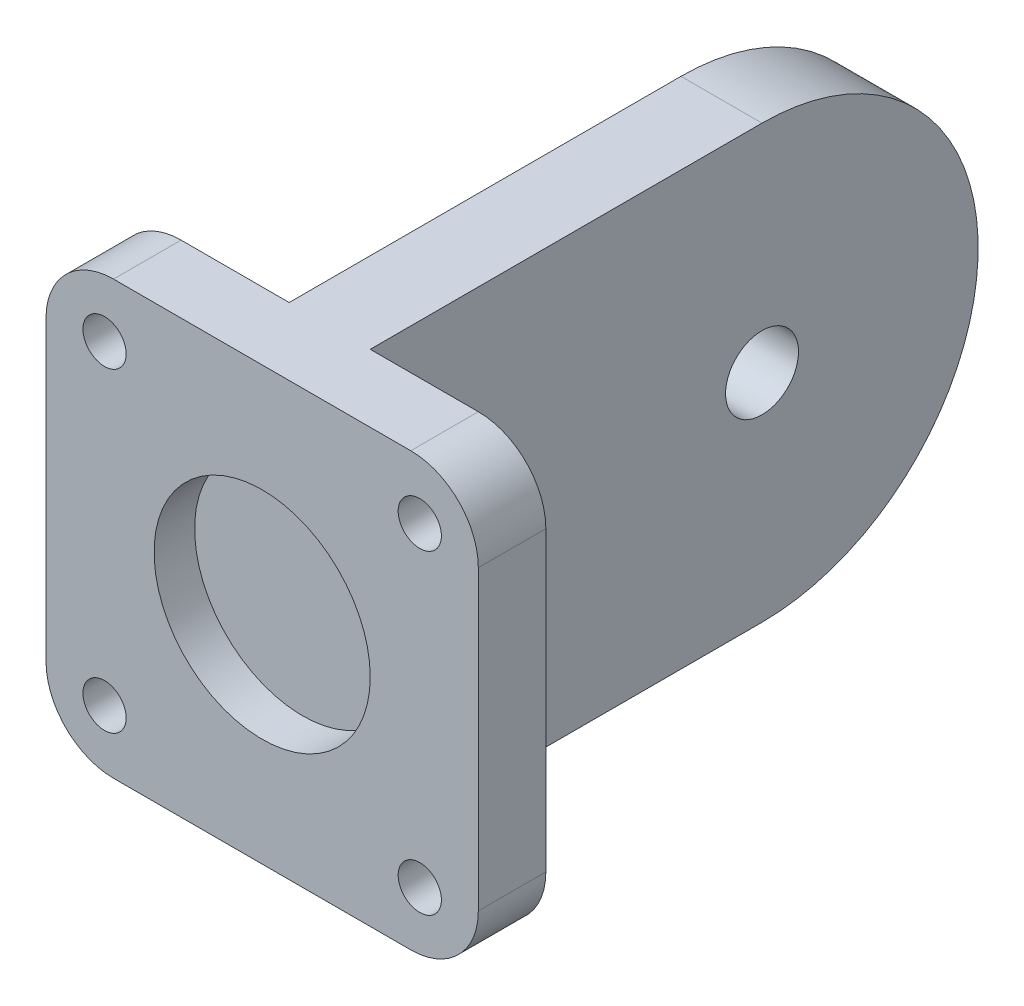
ISO-10303-21;
HEADER;
FILE_DESCRIPTION(('STEP AP214'),'2;1');
FILE_NAME('part.step','',(''),(''),'','','');
FILE_SCHEMA(('AUTOMOTIVE_DESIGN { 1 0 10303 214 1 1 1 1 }'));
ENDSEC;
DATA;
#1=APPLICATION_CONTEXT('core data for automotive mechanical design processes');
#2=APPLICATION_PROTOCOL_DEFINITION('international standard','automotive_design',2000,#1);
#3=PRODUCT_CONTEXT('',#1,'mechanical');
#4=PRODUCT('Part','Part','',(#3));
#5=PRODUCT_RELATED_PRODUCT_CATEGORY('part','',(#4));
#6=PRODUCT_DEFINITION_FORMATION('','',#4);
#7=PRODUCT_DEFINITION_CONTEXT('part definition',#1,'design');
#8=PRODUCT_DEFINITION('design','',#6,#7);
#9=PRODUCT_DEFINITION_SHAPE('','',#8);
#10=(LENGTH_UNIT() NAMED_UNIT(*) SI_UNIT(.MILLI.,.METRE.));
#11=(NAMED_UNIT(*) PLANE_ANGLE_UNIT() SI_UNIT($,.RADIAN.));
#12=(NAMED_UNIT(*) SI_UNIT($,.STERADIAN.) SOLID_ANGLE_UNIT());
#13=UNCERTAINTY_MEASURE_WITH_UNIT(LENGTH_MEASURE(1.E-05),#10,'distance_accuracy_value','');
#14=(GEOMETRIC_REPRESENTATION_CONTEXT(3) GLOBAL_UNCERTAINTY_ASSIGNED_CONTEXT((#13)) GLOBAL_UNIT_ASSIGNED_CONTEXT((#10,
#11,#12)) REPRESENTATION_CONTEXT('',''));
#15=CARTESIAN_POINT('',(0.,0.,0.));
#16=DIRECTION('',(0.,0.,1.));
#17=DIRECTION('',(1.,0.,0.));
#18=AXIS2_PLACEMENT_3D('',#15,#16,#17);
#19=CARTESIAN_POINT('',(0.,-9.48788221323319,-5.));
#20=DIRECTION('',(0.,-1.,0.));
#21=DIRECTION('',(0.,0.,-1.));
#22=AXIS2_PLACEMENT_3D('',#19,#20,#21);
#23=PLANE('',#22);
#24=DIRECTION('',(-1.,0.,0.));
#25=VECTOR('',#24,1.);
#26=CARTESIAN_POINT('',(16.0000000000001,-9.48788221323319,-34.));
#27=LINE('',#26,#25);
#28=CARTESIAN_POINT('',(2.99999999999792,-9.48788221323319,-34.));
#29=VERTEX_POINT('',#28);
#30=CARTESIAN_POINT('',(-3.00000000000208,-9.48788221323319,-34.));
#31=VERTEX_POINT('',#30);
#32=EDGE_CURVE('E52',#29,#31,#27,.T.);
#33=ORIENTED_EDGE('',*,*,#32,.T.);
#34=DIRECTION('',(0.,0.,1.));
#35=VECTOR('',#34,1.);
#36=CARTESIAN_POINT('',(-3.00000000000208,-9.48788221323319,0.));
#37=LINE('',#36,#35);
#38=CARTESIAN_POINT('',(-3.00000000000208,-9.48788221323319,-5.));
#39=VERTEX_POINT('',#38);
#40=EDGE_CURVE('E134',#31,#39,#37,.T.);
#41=ORIENTED_EDGE('',*,*,#40,.T.);
#42=DIRECTION('',(1.,0.,0.));
#43=VECTOR('',#42,1.);
#44=CARTESIAN_POINT('',(0.,-9.48788221323319,-5.));
#45=LINE('',#44,#43);
#46=CARTESIAN_POINT('',(-10.9999999999999,-9.48788221323319,-5.));
#47=VERTEX_POINT('',#46);
#48=EDGE_CURVE('E172',#47,#39,#45,.T.);
#49=ORIENTED_EDGE('',*,*,#48,.F.);
#50=DIRECTION('',(0.,0.,1.));
#51=VECTOR('',#50,1.);
#52=CARTESIAN_POINT('',(-10.9999999999999,-9.48788221323319,-5.));
#53=LINE('',#52,#51);
#54=CARTESIAN_POINT('',(-10.9999999999999,-9.48788221323319,0.));
#55=VERTEX_POINT('',#54);
#56=EDGE_CURVE('E194',#47,#55,#53,.T.);
#57=ORIENTED_EDGE('',*,*,#56,.T.);
#58=DIRECTION('',(1.,0.,0.));
#59=VECTOR('',#58,1.);
#60=CARTESIAN_POINT('',(0.,-9.48788221323319,0.));
#61=LINE('',#60,#59);
#62=CARTESIAN_POINT('',(11.,-9.48788221323319,0.));
#63=VERTEX_POINT('',#62);
#64=EDGE_CURVE('E206',#55,#63,#61,.T.);
#65=ORIENTED_EDGE('',*,*,#64,.T.);
#66=DIRECTION('',(0.,0.,1.));
#67=VECTOR('',#66,1.);
#68=CARTESIAN_POINT('',(11.,-9.48788221323319,-5.));
#69=LINE('',#68,#67);
#70=CARTESIAN_POINT('',(11.,-9.48788221323319,-5.));
#71=VERTEX_POINT('',#70);
#72=EDGE_CURVE('E11',#71,#63,#69,.T.);
#73=ORIENTED_EDGE('',*,*,#72,.F.);
#74=CARTESIAN_POINT('',(2.99999999999792,-9.48788221323319,-5.));
#75=VERTEX_POINT('',#74);
#76=EDGE_CURVE('E171',#75,#71,#45,.T.);
#77=ORIENTED_EDGE('',*,*,#76,.F.);
#78=DIRECTION('',(0.,0.,-1.));
#79=VECTOR('',#78,1.);
#80=CARTESIAN_POINT('',(2.99999999999792,-9.48788221323319,0.));
#81=LINE('',#80,#79);
#82=EDGE_CURVE('E59',#75,#29,#81,.T.);
#83=ORIENTED_EDGE('',*,*,#82,.T.);
#84=EDGE_LOOP('',(#33,#41,#49,#57,#65,#73,#77,#83));
#85=FACE_BOUND('',#84,.T.);
#86=ADVANCED_FACE('F35',(#85),#23,.F.);
#87=CARTESIAN_POINT('',(0.,-41.4878822132332,-5.));
#88=DIRECTION('',(0.,-1.,0.));
#89=DIRECTION('',(0.,0.,-1.));
#90=AXIS2_PLACEMENT_3D('',#87,#88,#89);
#91=PLANE('',#90);
#92=DIRECTION('',(0.,0.,1.));
#93=VECTOR('',#92,1.);
#94=CARTESIAN_POINT('',(-3.00000000000208,-41.4878822132332,0.));
#95=LINE('',#94,#93);
#96=CARTESIAN_POINT('',(-3.00000000000208,-41.4878822132332,-34.));
#97=VERTEX_POINT('',#96);
#98=CARTESIAN_POINT('',(-3.00000000000208,-41.4878822132332,-5.));
#99=VERTEX_POINT('',#98);
#100=EDGE_CURVE('E143',#97,#99,#95,.T.);
#101=ORIENTED_EDGE('',*,*,#100,.F.);
#102=DIRECTION('',(-1.,0.,0.));
#103=VECTOR('',#102,1.);
#104=CARTESIAN_POINT('',(16.0000000000001,-41.4878822132332,-34.));
#105=LINE('',#104,#103);
#106=CARTESIAN_POINT('',(2.99999999999792,-41.4878822132332,-34.));
#107=VERTEX_POINT('',#106);
#108=EDGE_CURVE('E127',#107,#97,#105,.T.);
#109=ORIENTED_EDGE('',*,*,#108,.F.);
#110=DIRECTION('',(0.,0.,-1.));
#111=VECTOR('',#110,1.);
#112=CARTESIAN_POINT('',(2.99999999999792,-41.4878822132332,0.));
#113=LINE('',#112,#111);
#114=CARTESIAN_POINT('',(2.99999999999792,-41.4878822132332,-5.));
#115=VERTEX_POINT('',#114);
#116=EDGE_CURVE('E145',#115,#107,#113,.T.);
#117=ORIENTED_EDGE('',*,*,#116,.F.);
#118=DIRECTION('',(1.,0.,0.));
#119=VECTOR('',#118,1.);
#120=CARTESIAN_POINT('',(0.,-41.4878822132332,-5.));
#121=LINE('',#120,#119);
#122=CARTESIAN_POINT('',(11.,-41.4878822132332,-5.));
#123=VERTEX_POINT('',#122);
#124=EDGE_CURVE('E183',#115,#123,#121,.T.);
#125=ORIENTED_EDGE('',*,*,#124,.T.);
#126=DIRECTION('',(0.,0.,1.));
#127=VECTOR('',#126,1.);
#128=CARTESIAN_POINT('',(11.,-41.4878822132332,-5.));
#129=LINE('',#128,#127);
#130=CARTESIAN_POINT('',(11.,-41.4878822132332,0.));
#131=VERTEX_POINT('',#130);
#132=EDGE_CURVE('E230',#123,#131,#129,.T.);
#133=ORIENTED_EDGE('',*,*,#132,.T.);
#134=DIRECTION('',(1.,0.,0.));
#135=VECTOR('',#134,1.);
#136=CARTESIAN_POINT('',(0.,-41.4878822132332,0.));
#137=LINE('',#136,#135);
#138=CARTESIAN_POINT('',(-10.9999999999999,-41.4878822132332,0.));
#139=VERTEX_POINT('',#138);
#140=EDGE_CURVE('E217',#139,#131,#137,.T.);
#141=ORIENTED_EDGE('',*,*,#140,.F.);
#142=DIRECTION('',(0.,0.,1.));
#143=VECTOR('',#142,1.);
#144=CARTESIAN_POINT('',(-10.9999999999999,-41.4878822132332,-5.));
#145=LINE('',#144,#143);
#146=CARTESIAN_POINT('',(-10.9999999999999,-41.4878822132332,-5.));
#147=VERTEX_POINT('',#146);
#148=EDGE_CURVE('E233',#147,#139,#145,.T.);
#149=ORIENTED_EDGE('',*,*,#148,.F.);
#150=EDGE_CURVE('E184',#147,#99,#121,.T.);
#151=ORIENTED_EDGE('',*,*,#150,.T.);
#152=EDGE_LOOP('',(#101,#109,#117,#125,#133,#141,#149,#151));
#153=FACE_BOUND('',#152,.T.);
#154=ADVANCED_FACE('F260',(#153),#91,.T.);
#155=CARTESIAN_POINT('',(0.,0.,-5.));
#156=DIRECTION('',(0.,0.,1.));
#157=DIRECTION('',(1.,0.,0.));
#158=AXIS2_PLACEMENT_3D('',#155,#156,#157);
#159=PLANE('',#158);
#160=CARTESIAN_POINT('',(-11.6672618895774,-37.1551441028118,-5.));
#161=DIRECTION('',(0.,0.,1.));
#162=DIRECTION('',(1.,0.,0.));
#163=AXIS2_PLACEMENT_3D('',#160,#161,#162);
#164=CIRCLE('',#163,1.6);
#165=CARTESIAN_POINT('',(-10.0672618895774,-37.1551441028118,-5.));
#166=VERTEX_POINT('',#165);
#167=EDGE_CURVE('E161',#166,#166,#164,.T.);
#168=ORIENTED_EDGE('',*,*,#167,.T.);
#169=EDGE_LOOP('',(#168));
#170=FACE_BOUND('',#169,.T.);
#171=CARTESIAN_POINT('',(-11.6672618895779,-13.8206203236557,-5.));
#172=DIRECTION('',(0.,0.,1.));
#173=DIRECTION('',(1.,0.,0.));
#174=AXIS2_PLACEMENT_3D('',#171,#172,#173);
#175=CIRCLE('',#174,1.6);
#176=CARTESIAN_POINT('',(-10.0672618895779,-13.8206203236557,-5.));
#177=VERTEX_POINT('',#176);
#178=EDGE_CURVE('E158',#177,#177,#175,.T.);
#179=ORIENTED_EDGE('',*,*,#178,.T.);
#180=EDGE_LOOP('',(#179));
#181=FACE_BOUND('',#180,.T.);
#182=ORIENTED_EDGE('',*,*,#48,.T.);
#183=DIRECTION('',(0.,-1.,0.));
#184=VECTOR('',#183,1.);
#185=CARTESIAN_POINT('',(-3.00000000000208,0.,-5.));
#186=LINE('',#185,#184);
#187=EDGE_CURVE('E141',#39,#99,#186,.T.);
#188=ORIENTED_EDGE('',*,*,#187,.T.);
#189=ORIENTED_EDGE('',*,*,#150,.F.);
#190=CARTESIAN_POINT('',(-10.9999999999999,-36.4878822132332,-5.));
#191=DIRECTION('',(0.,0.,1.));
#192=DIRECTION('',(1.,0.,0.));
#193=AXIS2_PLACEMENT_3D('',#190,#191,#192);
#194=CIRCLE('',#193,5.);
#195=CARTESIAN_POINT('',(-15.9999999999999,-36.4878822132332,-5.));
#196=VERTEX_POINT('',#195);
#197=EDGE_CURVE('E180',#196,#147,#194,.T.);
#198=ORIENTED_EDGE('',*,*,#197,.F.);
#199=DIRECTION('',(0.,-1.,0.));
#200=VECTOR('',#199,1.);
#201=CARTESIAN_POINT('',(-15.9999999999999,0.,-5.));
#202=LINE('',#201,#200);
#203=CARTESIAN_POINT('',(-15.9999999999999,-14.4878822132332,-5.));
#204=VERTEX_POINT('',#203);
#205=EDGE_CURVE('E177',#204,#196,#202,.T.);
#206=ORIENTED_EDGE('',*,*,#205,.F.);
#207=CARTESIAN_POINT('',(-10.9999999999999,-14.4878822132332,-5.));
#208=DIRECTION('',(0.,0.,1.));
#209=DIRECTION('',(1.,0.,0.));
#210=AXIS2_PLACEMENT_3D('',#207,#208,#209);
#211=CIRCLE('',#210,5.);
#212=EDGE_CURVE('E174',#47,#204,#211,.T.);
#213=ORIENTED_EDGE('',*,*,#212,.F.);
#214=EDGE_LOOP('',(#182,#188,#189,#198,#206,#213));
#215=FACE_BOUND('',#214,.T.);
#216=ADVANCED_FACE('F301',(#170,#181,#215),#159,.F.);
#217=CARTESIAN_POINT('',(11.0000000000001,-14.4878822132332,-5.));
#218=DIRECTION('',(0.,0.,1.));
#219=DIRECTION('',(1.,0.,0.));
#220=AXIS2_PLACEMENT_3D('',#217,#218,#219);
#221=CYLINDRICAL_SURFACE('',#220,5.);
#222=CARTESIAN_POINT('',(11.0000000000001,-14.4878822132332,0.));
#223=DIRECTION('',(0.,0.,1.));
#224=DIRECTION('',(1.,0.,0.));
#225=AXIS2_PLACEMENT_3D('',#222,#223,#224);
#226=CIRCLE('',#225,5.);
#227=CARTESIAN_POINT('',(16.0000000000001,-14.4878822132332,0.));
#228=VERTEX_POINT('',#227);
#229=EDGE_CURVE('E162',#63,#228,#226,.F.);
#230=ORIENTED_EDGE('',*,*,#229,.T.);
#231=DIRECTION('',(0.,0.,1.));
#232=VECTOR('',#231,1.);
#233=CARTESIAN_POINT('',(16.0000000000001,-14.4878822132332,-5.));
#234=LINE('',#233,#232);
#235=CARTESIAN_POINT('',(16.0000000000001,-14.4878822132332,-5.));
#236=VERTEX_POINT('',#235);
#237=EDGE_CURVE('E44',#236,#228,#234,.T.);
#238=ORIENTED_EDGE('',*,*,#237,.F.);
#239=CARTESIAN_POINT('',(11.0000000000001,-14.4878822132332,-5.));
#240=DIRECTION('',(0.,0.,1.));
#241=DIRECTION('',(1.,0.,0.));
#242=AXIS2_PLACEMENT_3D('',#239,#240,#241);
#243=CIRCLE('',#242,5.);
#244=EDGE_CURVE('E192',#71,#236,#243,.F.);
#245=ORIENTED_EDGE('',*,*,#244,.F.);
#246=ORIENTED_EDGE('',*,*,#72,.T.);
#247=EDGE_LOOP('',(#230,#238,#245,#246));
#248=FACE_BOUND('',#247,.T.);
#249=ADVANCED_FACE('F275',(#248),#221,.T.);
#250=CARTESIAN_POINT('',(16.0000000000001,0.,-5.));
#251=DIRECTION('',(-1.,0.,0.));
#252=DIRECTION('',(0.,-1.,0.));
#253=AXIS2_PLACEMENT_3D('',#250,#251,#252);
#254=PLANE('',#253);
#255=DIRECTION('',(0.,-1.,0.));
#256=VECTOR('',#255,1.);
#257=CARTESIAN_POINT('',(16.0000000000001,0.,0.));
#258=LINE('',#257,#256);
#259=CARTESIAN_POINT('',(16.0000000000001,-36.4878822132332,0.));
#260=VERTEX_POINT('',#259);
#261=EDGE_CURVE('E222',#228,#260,#258,.T.);
#262=ORIENTED_EDGE('',*,*,#261,.T.);
#263=DIRECTION('',(0.,0.,1.));
#264=VECTOR('',#263,1.);
#265=CARTESIAN_POINT('',(16.0000000000001,-36.4878822132332,-5.));
#266=LINE('',#265,#264);
#267=CARTESIAN_POINT('',(16.0000000000001,-36.4878822132332,-5.));
#268=VERTEX_POINT('',#267);
#269=EDGE_CURVE('E228',#268,#260,#266,.T.);
#270=ORIENTED_EDGE('',*,*,#269,.F.);
#271=DIRECTION('',(0.,-1.,0.));
#272=VECTOR('',#271,1.);
#273=CARTESIAN_POINT('',(16.0000000000001,0.,-5.));
#274=LINE('',#273,#272);
#275=EDGE_CURVE('E190',#236,#268,#274,.T.);
#276=ORIENTED_EDGE('',*,*,#275,.F.);
#277=ORIENTED_EDGE('',*,*,#237,.T.);
#278=EDGE_LOOP('',(#262,#270,#276,#277));
#279=FACE_BOUND('',#278,.T.);
#280=ADVANCED_FACE('F270',(#279),#254,.F.);
#281=CARTESIAN_POINT('',(11.0000000000001,-36.4878822132332,-5.));
#282=DIRECTION('',(0.,0.,1.));
#283=DIRECTION('',(1.,0.,0.));
#284=AXIS2_PLACEMENT_3D('',#281,#282,#283);
#285=CYLINDRICAL_SURFACE('',#284,5.);
#286=CARTESIAN_POINT('',(11.0000000000001,-36.4878822132332,0.));
#287=DIRECTION('',(0.,0.,1.));
#288=DIRECTION('',(1.,0.,0.));
#289=AXIS2_PLACEMENT_3D('',#286,#287,#288);
#290=CIRCLE('',#289,5.);
#291=EDGE_CURVE('E219',#131,#260,#290,.T.);
#292=ORIENTED_EDGE('',*,*,#291,.F.);
#293=ORIENTED_EDGE('',*,*,#132,.F.);
#294=CARTESIAN_POINT('',(11.0000000000001,-36.4878822132332,-5.));
#295=DIRECTION('',(0.,0.,1.));
#296=DIRECTION('',(1.,0.,0.));
#297=AXIS2_PLACEMENT_3D('',#294,#295,#296);
#298=CIRCLE('',#297,5.);
#299=EDGE_CURVE('E187',#123,#268,#298,.T.);
#300=ORIENTED_EDGE('',*,*,#299,.T.);
#301=ORIENTED_EDGE('',*,*,#269,.T.);
#302=EDGE_LOOP('',(#292,#293,#300,#301));
#303=FACE_BOUND('',#302,.T.);
#304=ADVANCED_FACE('F267',(#303),#285,.T.);
#305=CARTESIAN_POINT('',(-10.9999999999999,-36.4878822132332,-5.));
#306=DIRECTION('',(0.,0.,1.));
#307=DIRECTION('',(1.,0.,0.));
#308=AXIS2_PLACEMENT_3D('',#305,#306,#307);
#309=CYLINDRICAL_SURFACE('',#308,5.);
#310=CARTESIAN_POINT('',(-10.9999999999999,-36.4878822132332,0.));
#311=DIRECTION('',(0.,0.,1.));
#312=DIRECTION('',(1.,0.,0.));
#313=AXIS2_PLACEMENT_3D('',#310,#311,#312);
#314=CIRCLE('',#313,5.);
#315=CARTESIAN_POINT('',(-15.9999999999999,-36.4878822132332,0.));
#316=VERTEX_POINT('',#315);
#317=EDGE_CURVE('E214',#316,#139,#314,.T.);
#318=ORIENTED_EDGE('',*,*,#317,.F.);
#319=DIRECTION('',(0.,0.,1.));
#320=VECTOR('',#319,1.);
#321=CARTESIAN_POINT('',(-15.9999999999999,-36.4878822132332,-5.));
#322=LINE('',#321,#320);
#323=EDGE_CURVE('E235',#196,#316,#322,.T.);
#324=ORIENTED_EDGE('',*,*,#323,.F.);
#325=ORIENTED_EDGE('',*,*,#197,.T.);
#326=ORIENTED_EDGE('',*,*,#148,.T.);
#327=EDGE_LOOP('',(#318,#324,#325,#326));
#328=FACE_BOUND('',#327,.T.);
#329=ADVANCED_FACE('F256',(#328),#309,.T.);
#330=CARTESIAN_POINT('',(-15.9999999999999,0.,-5.));
#331=DIRECTION('',(-1.,0.,0.));
#332=DIRECTION('',(0.,-1.,0.));
#333=AXIS2_PLACEMENT_3D('',#330,#331,#332);
#334=PLANE('',#333);
#335=DIRECTION('',(0.,-1.,0.));
#336=VECTOR('',#335,1.);
#337=CARTESIAN_POINT('',(-15.9999999999999,0.,0.));
#338=LINE('',#337,#336);
#339=CARTESIAN_POINT('',(-15.9999999999999,-14.4878822132332,0.));
#340=VERTEX_POINT('',#339);
#341=EDGE_CURVE('E211',#340,#316,#338,.T.);
#342=ORIENTED_EDGE('',*,*,#341,.F.);
#343=DIRECTION('',(0.,0.,1.));
#344=VECTOR('',#343,1.);
#345=CARTESIAN_POINT('',(-15.9999999999999,-14.4878822132332,-5.));
#346=LINE('',#345,#344);
#347=EDGE_CURVE('E237',#204,#340,#346,.T.);
#348=ORIENTED_EDGE('',*,*,#347,.F.);
#349=ORIENTED_EDGE('',*,*,#205,.T.);
#350=ORIENTED_EDGE('',*,*,#323,.T.);
#351=EDGE_LOOP('',(#342,#348,#349,#350));
#352=FACE_BOUND('',#351,.T.);
#353=ADVANCED_FACE('F252',(#352),#334,.T.);
#354=CARTESIAN_POINT('',(11.6672618895781,-13.8206203236551,-5.));
#355=DIRECTION('',(0.,0.,1.));
#356=DIRECTION('',(1.,0.,0.));
#357=AXIS2_PLACEMENT_3D('',#354,#355,#356);
#358=CYLINDRICAL_SURFACE('',#357,1.6);
#359=CARTESIAN_POINT('',(11.6672618895781,-13.8206203236551,-5.));
#360=DIRECTION('',(0.,0.,1.));
#361=DIRECTION('',(1.,0.,0.));
#362=AXIS2_PLACEMENT_3D('',#359,#360,#361);
#363=CIRCLE('',#362,1.6);
#364=CARTESIAN_POINT('',(13.2672618895781,-13.8206203236551,-5.));
#365=VERTEX_POINT('',#364);
#366=EDGE_CURVE('E168',#365,#365,#363,.T.);
#367=ORIENTED_EDGE('',*,*,#366,.F.);
#368=EDGE_LOOP('',(#367));
#369=FACE_BOUND('',#368,.T.);
#370=CARTESIAN_POINT('',(11.6672618895781,-13.8206203236551,0.));
#371=DIRECTION('',(0.,0.,1.));
#372=DIRECTION('',(1.,0.,0.));
#373=AXIS2_PLACEMENT_3D('',#370,#371,#372);
#374=CIRCLE('',#373,1.6);
#375=CARTESIAN_POINT('',(13.2672618895781,-13.8206203236551,0.));
#376=VERTEX_POINT('',#375);
#377=EDGE_CURVE('E203',#376,#376,#374,.T.);
#378=ORIENTED_EDGE('',*,*,#377,.T.);
#379=EDGE_LOOP('',(#378));
#380=FACE_BOUND('',#379,.T.);
#381=ADVANCED_FACE('F312',(#369,#380),#358,.F.);
#382=CARTESIAN_POINT('',(11.6672618895788,-37.1551441028113,-5.));
#383=DIRECTION('',(0.,0.,1.));
#384=DIRECTION('',(1.,0.,0.));
#385=AXIS2_PLACEMENT_3D('',#382,#383,#384);
#386=CYLINDRICAL_SURFACE('',#385,1.6);
#387=CARTESIAN_POINT('',(11.6672618895788,-37.1551441028113,-5.));
#388=DIRECTION('',(0.,0.,1.));
#389=DIRECTION('',(1.,0.,0.));
#390=AXIS2_PLACEMENT_3D('',#387,#388,#389);
#391=CIRCLE('',#390,1.6);
#392=CARTESIAN_POINT('',(13.2672618895788,-37.1551441028113,-5.));
#393=VERTEX_POINT('',#392);
#394=EDGE_CURVE('E165',#393,#393,#391,.T.);
#395=ORIENTED_EDGE('',*,*,#394,.F.);
#396=EDGE_LOOP('',(#395));
#397=FACE_BOUND('',#396,.T.);
#398=CARTESIAN_POINT('',(11.6672618895788,-37.1551441028113,0.));
#399=DIRECTION('',(0.,0.,1.));
#400=DIRECTION('',(1.,0.,0.));
#401=AXIS2_PLACEMENT_3D('',#398,#399,#400);
#402=CIRCLE('',#401,1.6);
#403=CARTESIAN_POINT('',(13.2672618895788,-37.1551441028113,0.));
#404=VERTEX_POINT('',#403);
#405=EDGE_CURVE('E200',#404,#404,#402,.T.);
#406=ORIENTED_EDGE('',*,*,#405,.T.);
#407=EDGE_LOOP('',(#406));
#408=FACE_BOUND('',#407,.T.);
#409=ADVANCED_FACE('F315',(#397,#408),#386,.F.);
#410=CARTESIAN_POINT('',(-11.6672618895774,-37.1551441028118,-5.));
#411=DIRECTION('',(0.,0.,1.));
#412=DIRECTION('',(1.,0.,0.));
#413=AXIS2_PLACEMENT_3D('',#410,#411,#412);
#414=CYLINDRICAL_SURFACE('',#413,1.6);
#415=ORIENTED_EDGE('',*,*,#167,.F.);
#416=EDGE_LOOP('',(#415));
#417=FACE_BOUND('',#416,.T.);
#418=CARTESIAN_POINT('',(-11.6672618895774,-37.1551441028118,0.));
#419=DIRECTION('',(0.,0.,1.));
#420=DIRECTION('',(1.,0.,0.));
#421=AXIS2_PLACEMENT_3D('',#418,#419,#420);
#422=CIRCLE('',#421,1.6);
#423=CARTESIAN_POINT('',(-10.0672618895774,-37.1551441028118,0.));
#424=VERTEX_POINT('',#423);
#425=EDGE_CURVE('E197',#424,#424,#422,.T.);
#426=ORIENTED_EDGE('',*,*,#425,.T.);
#427=EDGE_LOOP('',(#426));
#428=FACE_BOUND('',#427,.T.);
#429=ADVANCED_FACE('F318',(#417,#428),#414,.F.);
#430=CARTESIAN_POINT('',(-11.6672618895779,-13.8206203236557,-5.));
#431=DIRECTION('',(0.,0.,1.));
#432=DIRECTION('',(1.,0.,0.));
#433=AXIS2_PLACEMENT_3D('',#430,#431,#432);
#434=CYLINDRICAL_SURFACE('',#433,1.6);
#435=ORIENTED_EDGE('',*,*,#178,.F.);
#436=EDGE_LOOP('',(#435));
#437=FACE_BOUND('',#436,.T.);
#438=CARTESIAN_POINT('',(-11.6672618895779,-13.8206203236557,0.));
#439=DIRECTION('',(0.,0.,1.));
#440=DIRECTION('',(1.,0.,0.));
#441=AXIS2_PLACEMENT_3D('',#438,#439,#440);
#442=CIRCLE('',#441,1.6);
#443=CARTESIAN_POINT('',(-10.0672618895779,-13.8206203236557,0.));
#444=VERTEX_POINT('',#443);
#445=EDGE_CURVE('E157',#444,#444,#442,.T.);
#446=ORIENTED_EDGE('',*,*,#445,.T.);
#447=EDGE_LOOP('',(#446));
#448=FACE_BOUND('',#447,.T.);
#449=ADVANCED_FACE('F37',(#437,#448),#434,.F.);
#450=CARTESIAN_POINT('',(-10.9999999999999,-14.4878822132332,-5.));
#451=DIRECTION('',(0.,0.,1.));
#452=DIRECTION('',(1.,0.,0.));
#453=AXIS2_PLACEMENT_3D('',#450,#451,#452);
#454=CYLINDRICAL_SURFACE('',#453,5.);
#455=CARTESIAN_POINT('',(-10.9999999999999,-14.4878822132332,0.));
#456=DIRECTION('',(0.,0.,1.));
#457=DIRECTION('',(1.,0.,0.));
#458=AXIS2_PLACEMENT_3D('',#455,#456,#457);
#459=CIRCLE('',#458,5.);
#460=EDGE_CURVE('E208',#55,#340,#459,.T.);
#461=ORIENTED_EDGE('',*,*,#460,.F.);
#462=ORIENTED_EDGE('',*,*,#56,.F.);
#463=ORIENTED_EDGE('',*,*,#212,.T.);
#464=ORIENTED_EDGE('',*,*,#347,.T.);
#465=EDGE_LOOP('',(#461,#462,#463,#464));
#466=FACE_BOUND('',#465,.T.);
#467=ADVANCED_FACE('F248',(#466),#454,.T.);
#468=ORIENTED_EDGE('',*,*,#394,.T.);
#469=EDGE_LOOP('',(#468));
#470=FACE_BOUND('',#469,.T.);
#471=ORIENTED_EDGE('',*,*,#366,.T.);
#472=EDGE_LOOP('',(#471));
#473=FACE_BOUND('',#472,.T.);
#474=ORIENTED_EDGE('',*,*,#124,.F.);
#475=DIRECTION('',(0.,1.,0.));
#476=VECTOR('',#475,1.);
#477=CARTESIAN_POINT('',(2.99999999999792,0.,-5.));
#478=LINE('',#477,#476);
#479=EDGE_CURVE('E153',#115,#75,#478,.T.);
#480=ORIENTED_EDGE('',*,*,#479,.T.);
#481=ORIENTED_EDGE('',*,*,#76,.T.);
#482=ORIENTED_EDGE('',*,*,#244,.T.);
#483=ORIENTED_EDGE('',*,*,#275,.T.);
#484=ORIENTED_EDGE('',*,*,#299,.F.);
#485=EDGE_LOOP('',(#474,#480,#481,#482,#483,#484));
#486=FACE_BOUND('',#485,.T.);
#487=ADVANCED_FACE('F277',(#470,#473,#486),#159,.F.);
#488=CARTESIAN_POINT('',(0.,0.,0.));
#489=DIRECTION('',(0.,0.,1.));
#490=DIRECTION('',(1.,0.,0.));
#491=AXIS2_PLACEMENT_3D('',#488,#489,#490);
#492=PLANE('',#491);
#493=CARTESIAN_POINT('',(0.,-25.4878822132332,0.));
#494=DIRECTION('',(0.,0.,1.));
#495=DIRECTION('',(1.,0.,0.));
#496=AXIS2_PLACEMENT_3D('',#493,#494,#495);
#497=CIRCLE('',#496,8.);
#498=CARTESIAN_POINT('',(8.00000000000007,-25.4878822132332,0.));
#499=VERTEX_POINT('',#498);
#500=EDGE_CURVE('E282',#499,#499,#497,.T.);
#501=ORIENTED_EDGE('',*,*,#500,.F.);
#502=EDGE_LOOP('',(#501));
#503=FACE_BOUND('',#502,.T.);
#504=ORIENTED_EDGE('',*,*,#229,.F.);
#505=ORIENTED_EDGE('',*,*,#64,.F.);
#506=ORIENTED_EDGE('',*,*,#460,.T.);
#507=ORIENTED_EDGE('',*,*,#341,.T.);
#508=ORIENTED_EDGE('',*,*,#317,.T.);
#509=ORIENTED_EDGE('',*,*,#140,.T.);
#510=ORIENTED_EDGE('',*,*,#291,.T.);
#511=ORIENTED_EDGE('',*,*,#261,.F.);
#512=EDGE_LOOP('',(#504,#505,#506,#507,#508,#509,#510,#511));
#513=FACE_BOUND('',#512,.T.);
#514=ORIENTED_EDGE('',*,*,#405,.F.);
#515=EDGE_LOOP('',(#514));
#516=FACE_BOUND('',#515,.T.);
#517=ORIENTED_EDGE('',*,*,#377,.F.);
#518=EDGE_LOOP('',(#517));
#519=FACE_BOUND('',#518,.T.);
#520=ORIENTED_EDGE('',*,*,#425,.F.);
#521=EDGE_LOOP('',(#520));
#522=FACE_BOUND('',#521,.T.);
#523=ORIENTED_EDGE('',*,*,#445,.F.);
#524=EDGE_LOOP('',(#523));
#525=FACE_BOUND('',#524,.T.);
#526=ADVANCED_FACE('F245',(#503,#513,#516,#519,#522,#525),#492,.T.);
#527=CARTESIAN_POINT('',(-3.00000000000208,-91.8465954612899,0.));
#528=DIRECTION('',(-1.,0.,0.));
#529=DIRECTION('',(0.,0.,1.));
#530=AXIS2_PLACEMENT_3D('',#527,#528,#529);
#531=PLANE('',#530);
#532=CARTESIAN_POINT('',(-3.00000000000208,-25.4878822132332,-34.));
#533=DIRECTION('',(1.,0.,0.));
#534=DIRECTION('',(0.,0.,1.));
#535=AXIS2_PLACEMENT_3D('',#532,#533,#534);
#536=CIRCLE('',#535,16.);
#537=EDGE_CURVE('E124',#97,#31,#536,.T.);
#538=ORIENTED_EDGE('',*,*,#537,.F.);
#539=ORIENTED_EDGE('',*,*,#100,.T.);
#540=ORIENTED_EDGE('',*,*,#187,.F.);
#541=ORIENTED_EDGE('',*,*,#40,.F.);
#542=EDGE_LOOP('',(#538,#539,#540,#541));
#543=FACE_BOUND('',#542,.T.);
#544=CARTESIAN_POINT('',(-3.00000000000208,-25.4878822132332,-34.));
#545=DIRECTION('',(-1.,0.,0.));
#546=DIRECTION('',(0.,0.,1.));
#547=AXIS2_PLACEMENT_3D('',#544,#545,#546);
#548=CIRCLE('',#547,2.7);
#549=CARTESIAN_POINT('',(-3.00000000000208,-25.4878822132332,-31.3));
#550=VERTEX_POINT('',#549);
#551=EDGE_CURVE('E149',#550,#550,#548,.T.);
#552=ORIENTED_EDGE('',*,*,#551,.F.);
#553=EDGE_LOOP('',(#552));
#554=FACE_BOUND('',#553,.T.);
#555=ADVANCED_FACE('F138',(#543,#554),#531,.T.);
#556=CARTESIAN_POINT('',(2.99999999999792,-91.8465954612899,0.));
#557=DIRECTION('',(1.,0.,0.));
#558=DIRECTION('',(0.,0.,-1.));
#559=AXIS2_PLACEMENT_3D('',#556,#557,#558);
#560=PLANE('',#559);
#561=ORIENTED_EDGE('',*,*,#116,.T.);
#562=CARTESIAN_POINT('',(2.99999999999792,-25.4878822132332,-34.));
#563=DIRECTION('',(1.,0.,0.));
#564=DIRECTION('',(0.,0.,-1.));
#565=AXIS2_PLACEMENT_3D('',#562,#563,#564);
#566=CIRCLE('',#565,16.);
#567=EDGE_CURVE('E280',#29,#107,#566,.F.);
#568=ORIENTED_EDGE('',*,*,#567,.F.);
#569=ORIENTED_EDGE('',*,*,#82,.F.);
#570=ORIENTED_EDGE('',*,*,#479,.F.);
#571=EDGE_LOOP('',(#561,#568,#569,#570));
#572=FACE_BOUND('',#571,.T.);
#573=CARTESIAN_POINT('',(2.99999999999792,-25.4878822132332,-34.));
#574=DIRECTION('',(1.,0.,0.));
#575=DIRECTION('',(0.,0.,-1.));
#576=AXIS2_PLACEMENT_3D('',#573,#574,#575);
#577=CIRCLE('',#576,2.7);
#578=CARTESIAN_POINT('',(2.99999999999792,-25.4878822132332,-36.7));
#579=VERTEX_POINT('',#578);
#580=EDGE_CURVE('E39',#579,#579,#577,.T.);
#581=ORIENTED_EDGE('',*,*,#580,.F.);
#582=EDGE_LOOP('',(#581));
#583=FACE_BOUND('',#582,.T.);
#584=ADVANCED_FACE('F278',(#572,#583),#560,.T.);
#585=CARTESIAN_POINT('',(3.99999999999792,-25.4878822132332,-34.));
#586=DIRECTION('',(-1.,0.,0.));
#587=DIRECTION('',(0.,0.,1.));
#588=AXIS2_PLACEMENT_3D('',#585,#586,#587);
#589=CYLINDRICAL_SURFACE('',#588,2.7);
#590=ORIENTED_EDGE('',*,*,#580,.T.);
#591=EDGE_LOOP('',(#590));
#592=FACE_BOUND('',#591,.T.);
#593=ORIENTED_EDGE('',*,*,#551,.T.);
#594=EDGE_LOOP('',(#593));
#595=FACE_BOUND('',#594,.T.);
#596=ADVANCED_FACE('F344',(#592,#595),#589,.F.);
#597=CARTESIAN_POINT('',(0.,-25.4878822132332,-3.));
#598=DIRECTION('',(0.,0.,1.));
#599=DIRECTION('',(1.,0.,0.));
#600=AXIS2_PLACEMENT_3D('',#597,#598,#599);
#601=CYLINDRICAL_SURFACE('',#600,8.);
#602=CARTESIAN_POINT('',(0.,-25.4878822132332,-3.));
#603=DIRECTION('',(0.,0.,1.));
#604=DIRECTION('',(1.,0.,0.));
#605=AXIS2_PLACEMENT_3D('',#602,#603,#604);
#606=CIRCLE('',#605,8.);
#607=CARTESIAN_POINT('',(8.00000000000007,-25.4878822132332,-3.));
#608=VERTEX_POINT('',#607);
#609=EDGE_CURVE('E285',#608,#608,#606,.T.);
#610=ORIENTED_EDGE('',*,*,#609,.F.);
#611=EDGE_LOOP('',(#610));
#612=FACE_BOUND('',#611,.T.);
#613=ORIENTED_EDGE('',*,*,#500,.T.);
#614=EDGE_LOOP('',(#613));
#615=FACE_BOUND('',#614,.T.);
#616=ADVANCED_FACE('F290',(#612,#615),#601,.F.);
#617=CARTESIAN_POINT('',(0.,-25.4878822132332,-3.));
#618=DIRECTION('',(0.,0.,1.));
#619=DIRECTION('',(1.,0.,0.));
#620=AXIS2_PLACEMENT_3D('',#617,#618,#619);
#621=PLANE('',#620);
#622=ORIENTED_EDGE('',*,*,#609,.T.);
#623=EDGE_LOOP('',(#622));
#624=FACE_BOUND('',#623,.T.);
#625=ADVANCED_FACE('F350',(#624),#621,.T.);
#626=CARTESIAN_POINT('',(16.0000000000001,-25.4878822132332,-34.));
#627=DIRECTION('',(-1.,0.,0.));
#628=DIRECTION('',(0.,0.,1.));
#629=AXIS2_PLACEMENT_3D('',#626,#627,#628);
#630=CYLINDRICAL_SURFACE('',#629,16.);
#631=ORIENTED_EDGE('',*,*,#567,.T.);
#632=ORIENTED_EDGE('',*,*,#108,.T.);
#633=ORIENTED_EDGE('',*,*,#537,.T.);
#634=ORIENTED_EDGE('',*,*,#32,.F.);
#635=EDGE_LOOP('',(#631,#632,#633,#634));
#636=FACE_BOUND('',#635,.T.);
#637=ADVANCED_FACE('F125',(#636),#630,.T.);
#638=CLOSED_SHELL('',(#86,#154,#216,#249,#280,#304,#329,#353,#381,#409,#429,#449,#467,#487,#526,
#555,#584,#596,#616,#625,#637));
#639=MANIFOLD_SOLID_BREP('B2',#638);
#640=ADVANCED_BREP_SHAPE_REPRESENTATION('',(#18,#639),#14);
#641=SHAPE_DEFINITION_REPRESENTATION(#9,#640);
ENDSEC;
END-ISO-10303-21;
